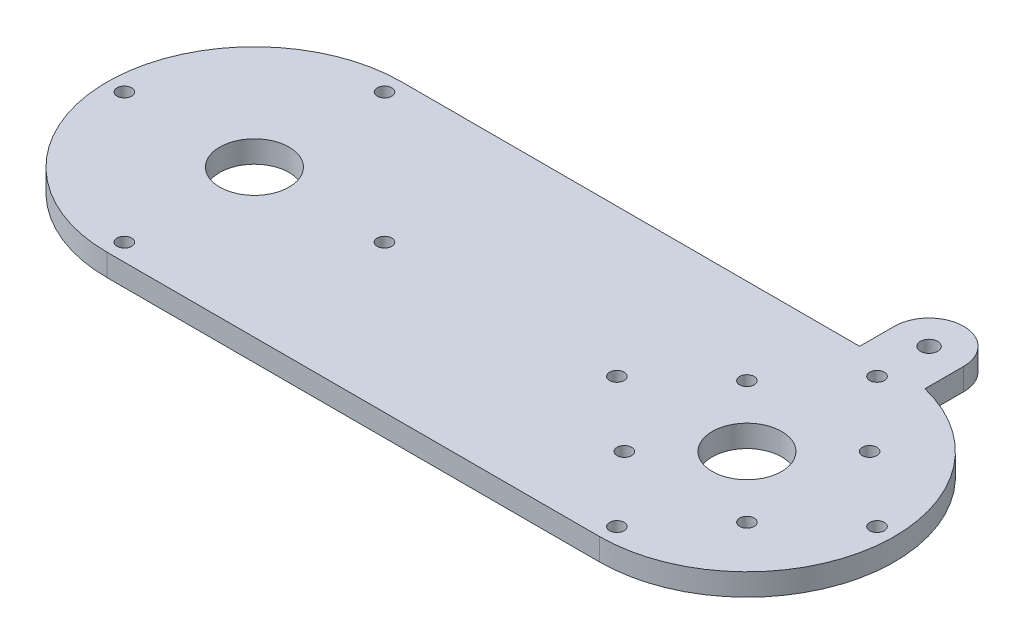
ISO-10303-21;
HEADER;
FILE_DESCRIPTION(('STEP AP214'),'2;1');
FILE_NAME('part.step','',(''),(''),'','','');
FILE_SCHEMA(('AUTOMOTIVE_DESIGN { 1 0 10303 214 1 1 1 1 }'));
ENDSEC;
DATA;
#1=APPLICATION_CONTEXT('core data for automotive mechanical design processes');
#2=APPLICATION_PROTOCOL_DEFINITION('international standard','automotive_design',2000,#1);
#3=PRODUCT_CONTEXT('',#1,'mechanical');
#4=PRODUCT('Part','Part','',(#3));
#5=PRODUCT_RELATED_PRODUCT_CATEGORY('part','',(#4));
#6=PRODUCT_DEFINITION_FORMATION('','',#4);
#7=PRODUCT_DEFINITION_CONTEXT('part definition',#1,'design');
#8=PRODUCT_DEFINITION('design','',#6,#7);
#9=PRODUCT_DEFINITION_SHAPE('','',#8);
#10=(LENGTH_UNIT() NAMED_UNIT(*) SI_UNIT(.MILLI.,.METRE.));
#11=(NAMED_UNIT(*) PLANE_ANGLE_UNIT() SI_UNIT($,.RADIAN.));
#12=(NAMED_UNIT(*) SI_UNIT($,.STERADIAN.) SOLID_ANGLE_UNIT());
#13=UNCERTAINTY_MEASURE_WITH_UNIT(LENGTH_MEASURE(1.E-05),#10,'distance_accuracy_value','');
#14=(GEOMETRIC_REPRESENTATION_CONTEXT(3) GLOBAL_UNCERTAINTY_ASSIGNED_CONTEXT((#13)) GLOBAL_UNIT_ASSIGNED_CONTEXT((#10,
#11,#12)) REPRESENTATION_CONTEXT('',''));
#15=CARTESIAN_POINT('',(0.,0.,0.));
#16=DIRECTION('',(0.,0.,1.));
#17=DIRECTION('',(1.,0.,0.));
#18=AXIS2_PLACEMENT_3D('',#15,#16,#17);
#19=CARTESIAN_POINT('',(0.,-6.35,42.5));
#20=DIRECTION('',(0.,0.,1.));
#21=DIRECTION('',(1.,0.,0.));
#22=AXIS2_PLACEMENT_3D('',#19,#20,#21);
#23=PLANE('',#22);
#24=DIRECTION('',(1.,0.,0.));
#25=VECTOR('',#24,1.);
#26=CARTESIAN_POINT('',(0.,0.,42.5));
#27=LINE('',#26,#25);
#28=CARTESIAN_POINT('',(-142.,0.,42.5));
#29=VERTEX_POINT('',#28);
#30=CARTESIAN_POINT('',(0.,0.,42.5));
#31=VERTEX_POINT('',#30);
#32=EDGE_CURVE('E171',#29,#31,#27,.T.);
#33=ORIENTED_EDGE('',*,*,#32,.F.);
#34=DIRECTION('',(0.,1.,0.));
#35=VECTOR('',#34,1.);
#36=CARTESIAN_POINT('',(-142.,-6.35,42.5));
#37=LINE('',#36,#35);
#38=CARTESIAN_POINT('',(-142.,-6.35,42.5));
#39=VERTEX_POINT('',#38);
#40=EDGE_CURVE('E11',#39,#29,#37,.T.);
#41=ORIENTED_EDGE('',*,*,#40,.F.);
#42=DIRECTION('',(1.,0.,0.));
#43=VECTOR('',#42,1.);
#44=CARTESIAN_POINT('',(0.,-6.35,42.5));
#45=LINE('',#44,#43);
#46=CARTESIAN_POINT('',(0.,-6.35,42.5));
#47=VERTEX_POINT('',#46);
#48=EDGE_CURVE('E233',#39,#47,#45,.T.);
#49=ORIENTED_EDGE('',*,*,#48,.T.);
#50=DIRECTION('',(0.,1.,0.));
#51=VECTOR('',#50,1.);
#52=CARTESIAN_POINT('',(0.,-6.35,42.5));
#53=LINE('',#52,#51);
#54=EDGE_CURVE('E37',#47,#31,#53,.T.);
#55=ORIENTED_EDGE('',*,*,#54,.T.);
#56=EDGE_LOOP('',(#33,#41,#49,#55));
#57=FACE_BOUND('',#56,.T.);
#58=ADVANCED_FACE('F34',(#57),#23,.T.);
#59=CARTESIAN_POINT('',(-142.,-6.35,0.));
#60=DIRECTION('',(0.,1.,0.));
#61=DIRECTION('',(0.,0.,1.));
#62=AXIS2_PLACEMENT_3D('',#59,#60,#61);
#63=CYLINDRICAL_SURFACE('',#62,42.5);
#64=CARTESIAN_POINT('',(-142.,0.,0.));
#65=DIRECTION('',(0.,1.,0.));
#66=DIRECTION('',(0.,0.,1.));
#67=AXIS2_PLACEMENT_3D('',#64,#65,#66);
#68=CIRCLE('',#67,42.5);
#69=CARTESIAN_POINT('',(-142.,0.,-42.5));
#70=VERTEX_POINT('',#69);
#71=EDGE_CURVE('E186',#70,#29,#68,.T.);
#72=ORIENTED_EDGE('',*,*,#71,.F.);
#73=DIRECTION('',(0.,1.,0.));
#74=VECTOR('',#73,1.);
#75=CARTESIAN_POINT('',(-142.,-6.35,-42.5));
#76=LINE('',#75,#74);
#77=CARTESIAN_POINT('',(-142.,-6.35,-42.5));
#78=VERTEX_POINT('',#77);
#79=EDGE_CURVE('E43',#78,#70,#76,.T.);
#80=ORIENTED_EDGE('',*,*,#79,.F.);
#81=CARTESIAN_POINT('',(-142.,-6.35,0.));
#82=DIRECTION('',(0.,1.,0.));
#83=DIRECTION('',(0.,0.,1.));
#84=AXIS2_PLACEMENT_3D('',#81,#82,#83);
#85=CIRCLE('',#84,42.5);
#86=EDGE_CURVE('E106',#78,#39,#85,.T.);
#87=ORIENTED_EDGE('',*,*,#86,.T.);
#88=ORIENTED_EDGE('',*,*,#40,.T.);
#89=EDGE_LOOP('',(#72,#80,#87,#88));
#90=FACE_BOUND('',#89,.T.);
#91=ADVANCED_FACE('F245',(#90),#63,.T.);
#92=CARTESIAN_POINT('',(0.,-6.35,-42.5));
#93=DIRECTION('',(0.,0.,1.));
#94=DIRECTION('',(1.,0.,0.));
#95=AXIS2_PLACEMENT_3D('',#92,#93,#94);
#96=PLANE('',#95);
#97=DIRECTION('',(1.,0.,0.));
#98=VECTOR('',#97,1.);
#99=CARTESIAN_POINT('',(0.,0.,-42.5));
#100=LINE('',#99,#98);
#101=CARTESIAN_POINT('',(-10.,0.,-42.5));
#102=VERTEX_POINT('',#101);
#103=EDGE_CURVE('E111',#70,#102,#100,.T.);
#104=ORIENTED_EDGE('',*,*,#103,.T.);
#105=DIRECTION('',(0.,1.,0.));
#106=VECTOR('',#105,1.);
#107=CARTESIAN_POINT('',(-10.,-6.35,-42.5));
#108=LINE('',#107,#106);
#109=CARTESIAN_POINT('',(-10.,-6.35,-42.5));
#110=VERTEX_POINT('',#109);
#111=EDGE_CURVE('E109',#110,#102,#108,.T.);
#112=ORIENTED_EDGE('',*,*,#111,.F.);
#113=DIRECTION('',(1.,0.,0.));
#114=VECTOR('',#113,1.);
#115=CARTESIAN_POINT('',(0.,-6.35,-42.5));
#116=LINE('',#115,#114);
#117=EDGE_CURVE('E98',#78,#110,#116,.T.);
#118=ORIENTED_EDGE('',*,*,#117,.F.);
#119=ORIENTED_EDGE('',*,*,#79,.T.);
#120=EDGE_LOOP('',(#104,#112,#118,#119));
#121=FACE_BOUND('',#120,.T.);
#122=ADVANCED_FACE('F110',(#121),#96,.F.);
#123=CARTESIAN_POINT('',(-10.0000000000001,-6.35,0.));
#124=DIRECTION('',(1.,0.,0.));
#125=DIRECTION('',(0.,0.,-1.));
#126=AXIS2_PLACEMENT_3D('',#123,#124,#125);
#127=PLANE('',#126);
#128=DIRECTION('',(0.,0.,-1.));
#129=VECTOR('',#128,1.);
#130=CARTESIAN_POINT('',(-10.0000000000001,0.,0.));
#131=LINE('',#130,#129);
#132=CARTESIAN_POINT('',(-10.,0.,-52.5));
#133=VERTEX_POINT('',#132);
#134=EDGE_CURVE('E183',#102,#133,#131,.T.);
#135=ORIENTED_EDGE('',*,*,#134,.T.);
#136=DIRECTION('',(0.,1.,0.));
#137=VECTOR('',#136,1.);
#138=CARTESIAN_POINT('',(-10.,-6.35,-52.5));
#139=LINE('',#138,#137);
#140=CARTESIAN_POINT('',(-10.,-6.35,-52.5));
#141=VERTEX_POINT('',#140);
#142=EDGE_CURVE('E115',#141,#133,#139,.T.);
#143=ORIENTED_EDGE('',*,*,#142,.F.);
#144=DIRECTION('',(0.,0.,-1.));
#145=VECTOR('',#144,1.);
#146=CARTESIAN_POINT('',(-10.0000000000001,-6.35,0.));
#147=LINE('',#146,#145);
#148=EDGE_CURVE('E104',#110,#141,#147,.T.);
#149=ORIENTED_EDGE('',*,*,#148,.F.);
#150=ORIENTED_EDGE('',*,*,#111,.T.);
#151=EDGE_LOOP('',(#135,#143,#149,#150));
#152=FACE_BOUND('',#151,.T.);
#153=ADVANCED_FACE('F117',(#152),#127,.F.);
#154=CARTESIAN_POINT('',(0.,-6.35,-52.5));
#155=DIRECTION('',(0.,1.,0.));
#156=DIRECTION('',(0.,0.,1.));
#157=AXIS2_PLACEMENT_3D('',#154,#155,#156);
#158=CYLINDRICAL_SURFACE('',#157,10.);
#159=CARTESIAN_POINT('',(0.,0.,-52.5));
#160=DIRECTION('',(0.,1.,0.));
#161=DIRECTION('',(0.,0.,1.));
#162=AXIS2_PLACEMENT_3D('',#159,#160,#161);
#163=CIRCLE('',#162,10.);
#164=CARTESIAN_POINT('',(10.,0.,-52.5));
#165=VERTEX_POINT('',#164);
#166=EDGE_CURVE('E180',#165,#133,#163,.T.);
#167=ORIENTED_EDGE('',*,*,#166,.F.);
#168=DIRECTION('',(0.,1.,0.));
#169=VECTOR('',#168,1.);
#170=CARTESIAN_POINT('',(10.,-6.35,-52.5));
#171=LINE('',#170,#169);
#172=CARTESIAN_POINT('',(10.,-6.35,-52.5));
#173=VERTEX_POINT('',#172);
#174=EDGE_CURVE('E237',#173,#165,#171,.T.);
#175=ORIENTED_EDGE('',*,*,#174,.F.);
#176=CARTESIAN_POINT('',(0.,-6.35,-52.5));
#177=DIRECTION('',(0.,1.,0.));
#178=DIRECTION('',(0.,0.,1.));
#179=AXIS2_PLACEMENT_3D('',#176,#177,#178);
#180=CIRCLE('',#179,10.);
#181=EDGE_CURVE('E119',#173,#141,#180,.T.);
#182=ORIENTED_EDGE('',*,*,#181,.T.);
#183=ORIENTED_EDGE('',*,*,#142,.T.);
#184=EDGE_LOOP('',(#167,#175,#182,#183));
#185=FACE_BOUND('',#184,.T.);
#186=ADVANCED_FACE('F259',(#185),#158,.T.);
#187=CARTESIAN_POINT('',(9.99999999999993,-6.35,0.));
#188=DIRECTION('',(-1.,0.,0.));
#189=DIRECTION('',(0.,0.,1.));
#190=AXIS2_PLACEMENT_3D('',#187,#188,#189);
#191=PLANE('',#190);
#192=DIRECTION('',(0.,0.,1.));
#193=VECTOR('',#192,1.);
#194=CARTESIAN_POINT('',(9.99999999999993,0.,0.));
#195=LINE('',#194,#193);
#196=CARTESIAN_POINT('',(9.99999999999999,0.,-41.3067791046458));
#197=VERTEX_POINT('',#196);
#198=EDGE_CURVE('E177',#165,#197,#195,.T.);
#199=ORIENTED_EDGE('',*,*,#198,.T.);
#200=DIRECTION('',(0.,1.,0.));
#201=VECTOR('',#200,1.);
#202=CARTESIAN_POINT('',(9.99999999999999,-6.35,-41.3067791046458));
#203=LINE('',#202,#201);
#204=CARTESIAN_POINT('',(9.99999999999999,-6.35,-41.3067791046458));
#205=VERTEX_POINT('',#204);
#206=EDGE_CURVE('E238',#205,#197,#203,.T.);
#207=ORIENTED_EDGE('',*,*,#206,.F.);
#208=DIRECTION('',(0.,0.,1.));
#209=VECTOR('',#208,1.);
#210=CARTESIAN_POINT('',(9.99999999999993,-6.35,0.));
#211=LINE('',#210,#209);
#212=EDGE_CURVE('E121',#173,#205,#211,.T.);
#213=ORIENTED_EDGE('',*,*,#212,.F.);
#214=ORIENTED_EDGE('',*,*,#174,.T.);
#215=EDGE_LOOP('',(#199,#207,#213,#214));
#216=FACE_BOUND('',#215,.T.);
#217=ADVANCED_FACE('F262',(#216),#191,.F.);
#218=CARTESIAN_POINT('',(-179.5,-6.35,0.));
#219=DIRECTION('',(0.,1.,0.));
#220=DIRECTION('',(0.,0.,1.));
#221=AXIS2_PLACEMENT_3D('',#218,#219,#220);
#222=CYLINDRICAL_SURFACE('',#221,2.09999999999999);
#223=CARTESIAN_POINT('',(-179.5,-6.35,0.));
#224=DIRECTION('',(0.,1.,0.));
#225=DIRECTION('',(0.,0.,1.));
#226=AXIS2_PLACEMENT_3D('',#223,#224,#225);
#227=CIRCLE('',#226,2.09999999999999);
#228=CARTESIAN_POINT('',(-179.5,-6.35,2.09999999999999));
#229=VERTEX_POINT('',#228);
#230=EDGE_CURVE('E165',#229,#229,#227,.T.);
#231=ORIENTED_EDGE('',*,*,#230,.F.);
#232=EDGE_LOOP('',(#231));
#233=FACE_BOUND('',#232,.T.);
#234=CARTESIAN_POINT('',(-179.5,0.,0.));
#235=DIRECTION('',(0.,1.,0.));
#236=DIRECTION('',(0.,0.,1.));
#237=AXIS2_PLACEMENT_3D('',#234,#235,#236);
#238=CIRCLE('',#237,2.09999999999999);
#239=CARTESIAN_POINT('',(-179.5,0.,2.09999999999999));
#240=VERTEX_POINT('',#239);
#241=EDGE_CURVE('E228',#240,#240,#238,.T.);
#242=ORIENTED_EDGE('',*,*,#241,.T.);
#243=EDGE_LOOP('',(#242));
#244=FACE_BOUND('',#243,.T.);
#245=ADVANCED_FACE('F265',(#233,#244),#222,.F.);
#246=CARTESIAN_POINT('',(-142.,-6.35,-37.5));
#247=DIRECTION('',(0.,1.,0.));
#248=DIRECTION('',(0.,0.,1.));
#249=AXIS2_PLACEMENT_3D('',#246,#247,#248);
#250=CYLINDRICAL_SURFACE('',#249,2.09999999999999);
#251=CARTESIAN_POINT('',(-142.,-6.35,-37.5));
#252=DIRECTION('',(0.,1.,0.));
#253=DIRECTION('',(0.,0.,1.));
#254=AXIS2_PLACEMENT_3D('',#251,#252,#253);
#255=CIRCLE('',#254,2.09999999999999);
#256=CARTESIAN_POINT('',(-142.,-6.35,-35.4));
#257=VERTEX_POINT('',#256);
#258=EDGE_CURVE('E162',#257,#257,#255,.T.);
#259=ORIENTED_EDGE('',*,*,#258,.F.);
#260=EDGE_LOOP('',(#259));
#261=FACE_BOUND('',#260,.T.);
#262=CARTESIAN_POINT('',(-142.,0.,-37.5));
#263=DIRECTION('',(0.,1.,0.));
#264=DIRECTION('',(0.,0.,1.));
#265=AXIS2_PLACEMENT_3D('',#262,#263,#264);
#266=CIRCLE('',#265,2.09999999999999);
#267=CARTESIAN_POINT('',(-142.,0.,-35.4));
#268=VERTEX_POINT('',#267);
#269=EDGE_CURVE('E225',#268,#268,#266,.T.);
#270=ORIENTED_EDGE('',*,*,#269,.T.);
#271=EDGE_LOOP('',(#270));
#272=FACE_BOUND('',#271,.T.);
#273=ADVANCED_FACE('F318',(#261,#272),#250,.F.);
#274=CARTESIAN_POINT('',(-142.,-6.35,37.5));
#275=DIRECTION('',(0.,1.,0.));
#276=DIRECTION('',(0.,0.,1.));
#277=AXIS2_PLACEMENT_3D('',#274,#275,#276);
#278=CYLINDRICAL_SURFACE('',#277,2.09999999999999);
#279=CARTESIAN_POINT('',(-142.,-6.35,37.5));
#280=DIRECTION('',(0.,1.,0.));
#281=DIRECTION('',(0.,0.,1.));
#282=AXIS2_PLACEMENT_3D('',#279,#280,#281);
#283=CIRCLE('',#282,2.09999999999999);
#284=CARTESIAN_POINT('',(-142.,-6.35,39.6));
#285=VERTEX_POINT('',#284);
#286=EDGE_CURVE('E159',#285,#285,#283,.T.);
#287=ORIENTED_EDGE('',*,*,#286,.F.);
#288=EDGE_LOOP('',(#287));
#289=FACE_BOUND('',#288,.T.);
#290=CARTESIAN_POINT('',(-142.,0.,37.5));
#291=DIRECTION('',(0.,1.,0.));
#292=DIRECTION('',(0.,0.,1.));
#293=AXIS2_PLACEMENT_3D('',#290,#291,#292);
#294=CIRCLE('',#293,2.09999999999999);
#295=CARTESIAN_POINT('',(-142.,0.,39.6));
#296=VERTEX_POINT('',#295);
#297=EDGE_CURVE('E222',#296,#296,#294,.T.);
#298=ORIENTED_EDGE('',*,*,#297,.T.);
#299=EDGE_LOOP('',(#298));
#300=FACE_BOUND('',#299,.T.);
#301=ADVANCED_FACE('F324',(#289,#300),#278,.F.);
#302=CARTESIAN_POINT('',(-104.5,-6.35,0.));
#303=DIRECTION('',(0.,1.,0.));
#304=DIRECTION('',(0.,0.,1.));
#305=AXIS2_PLACEMENT_3D('',#302,#303,#304);
#306=CYLINDRICAL_SURFACE('',#305,2.1);
#307=CARTESIAN_POINT('',(-104.5,-6.35,0.));
#308=DIRECTION('',(0.,1.,0.));
#309=DIRECTION('',(0.,0.,1.));
#310=AXIS2_PLACEMENT_3D('',#307,#308,#309);
#311=CIRCLE('',#310,2.1);
#312=CARTESIAN_POINT('',(-104.5,-6.35,2.1));
#313=VERTEX_POINT('',#312);
#314=EDGE_CURVE('E156',#313,#313,#311,.T.);
#315=ORIENTED_EDGE('',*,*,#314,.F.);
#316=EDGE_LOOP('',(#315));
#317=FACE_BOUND('',#316,.T.);
#318=CARTESIAN_POINT('',(-104.5,0.,0.));
#319=DIRECTION('',(0.,1.,0.));
#320=DIRECTION('',(0.,0.,1.));
#321=AXIS2_PLACEMENT_3D('',#318,#319,#320);
#322=CIRCLE('',#321,2.1);
#323=CARTESIAN_POINT('',(-104.5,0.,2.1));
#324=VERTEX_POINT('',#323);
#325=EDGE_CURVE('E219',#324,#324,#322,.T.);
#326=ORIENTED_EDGE('',*,*,#325,.T.);
#327=EDGE_LOOP('',(#326));
#328=FACE_BOUND('',#327,.T.);
#329=ADVANCED_FACE('F331',(#317,#328),#306,.F.);
#330=CARTESIAN_POINT('',(0.,-6.35,0.));
#331=DIRECTION('',(0.,1.,0.));
#332=DIRECTION('',(0.,0.,1.));
#333=AXIS2_PLACEMENT_3D('',#330,#331,#332);
#334=CYLINDRICAL_SURFACE('',#333,10.);
#335=CARTESIAN_POINT('',(0.,-6.35,0.));
#336=DIRECTION('',(0.,1.,0.));
#337=DIRECTION('',(0.,0.,1.));
#338=AXIS2_PLACEMENT_3D('',#335,#336,#337);
#339=CIRCLE('',#338,10.);
#340=CARTESIAN_POINT('',(0.,-6.35,10.));
#341=VERTEX_POINT('',#340);
#342=EDGE_CURVE('E153',#341,#341,#339,.T.);
#343=ORIENTED_EDGE('',*,*,#342,.F.);
#344=EDGE_LOOP('',(#343));
#345=FACE_BOUND('',#344,.T.);
#346=CARTESIAN_POINT('',(0.,0.,0.));
#347=DIRECTION('',(0.,1.,0.));
#348=DIRECTION('',(0.,0.,1.));
#349=AXIS2_PLACEMENT_3D('',#346,#347,#348);
#350=CIRCLE('',#349,10.);
#351=CARTESIAN_POINT('',(0.,0.,10.));
#352=VERTEX_POINT('',#351);
#353=EDGE_CURVE('E216',#352,#352,#350,.T.);
#354=ORIENTED_EDGE('',*,*,#353,.T.);
#355=EDGE_LOOP('',(#354));
#356=FACE_BOUND('',#355,.T.);
#357=ADVANCED_FACE('F335',(#345,#356),#334,.F.);
#358=CARTESIAN_POINT('',(0.,-6.35,-37.5));
#359=DIRECTION('',(0.,1.,0.));
#360=DIRECTION('',(0.,0.,1.));
#361=AXIS2_PLACEMENT_3D('',#358,#359,#360);
#362=CYLINDRICAL_SURFACE('',#361,2.1);
#363=CARTESIAN_POINT('',(0.,-6.35,-37.5));
#364=DIRECTION('',(0.,1.,0.));
#365=DIRECTION('',(0.,0.,1.));
#366=AXIS2_PLACEMENT_3D('',#363,#364,#365);
#367=CIRCLE('',#366,2.1);
#368=CARTESIAN_POINT('',(0.,-6.35,-35.4));
#369=VERTEX_POINT('',#368);
#370=EDGE_CURVE('E150',#369,#369,#367,.T.);
#371=ORIENTED_EDGE('',*,*,#370,.F.);
#372=EDGE_LOOP('',(#371));
#373=FACE_BOUND('',#372,.T.);
#374=CARTESIAN_POINT('',(0.,0.,-37.5));
#375=DIRECTION('',(0.,1.,0.));
#376=DIRECTION('',(0.,0.,1.));
#377=AXIS2_PLACEMENT_3D('',#374,#375,#376);
#378=CIRCLE('',#377,2.1);
#379=CARTESIAN_POINT('',(0.,0.,-35.4));
#380=VERTEX_POINT('',#379);
#381=EDGE_CURVE('E213',#380,#380,#378,.T.);
#382=ORIENTED_EDGE('',*,*,#381,.T.);
#383=EDGE_LOOP('',(#382));
#384=FACE_BOUND('',#383,.T.);
#385=ADVANCED_FACE('F339',(#373,#384),#362,.F.);
#386=CARTESIAN_POINT('',(37.5,-6.35,0.));
#387=DIRECTION('',(0.,1.,0.));
#388=DIRECTION('',(0.,0.,1.));
#389=AXIS2_PLACEMENT_3D('',#386,#387,#388);
#390=CYLINDRICAL_SURFACE('',#389,2.1);
#391=CARTESIAN_POINT('',(37.5,-6.35,0.));
#392=DIRECTION('',(0.,1.,0.));
#393=DIRECTION('',(0.,0.,1.));
#394=AXIS2_PLACEMENT_3D('',#391,#392,#393);
#395=CIRCLE('',#394,2.1);
#396=CARTESIAN_POINT('',(37.5,-6.35,2.1));
#397=VERTEX_POINT('',#396);
#398=EDGE_CURVE('E147',#397,#397,#395,.T.);
#399=ORIENTED_EDGE('',*,*,#398,.F.);
#400=EDGE_LOOP('',(#399));
#401=FACE_BOUND('',#400,.T.);
#402=CARTESIAN_POINT('',(37.5,0.,0.));
#403=DIRECTION('',(0.,1.,0.));
#404=DIRECTION('',(0.,0.,1.));
#405=AXIS2_PLACEMENT_3D('',#402,#403,#404);
#406=CIRCLE('',#405,2.1);
#407=CARTESIAN_POINT('',(37.5,0.,2.1));
#408=VERTEX_POINT('',#407);
#409=EDGE_CURVE('E210',#408,#408,#406,.T.);
#410=ORIENTED_EDGE('',*,*,#409,.T.);
#411=EDGE_LOOP('',(#410));
#412=FACE_BOUND('',#411,.T.);
#413=ADVANCED_FACE('F343',(#401,#412),#390,.F.);
#414=CARTESIAN_POINT('',(0.,-6.35,37.5));
#415=DIRECTION('',(0.,1.,0.));
#416=DIRECTION('',(0.,0.,1.));
#417=AXIS2_PLACEMENT_3D('',#414,#415,#416);
#418=CYLINDRICAL_SURFACE('',#417,2.1);
#419=CARTESIAN_POINT('',(0.,-6.35,37.5));
#420=DIRECTION('',(0.,1.,0.));
#421=DIRECTION('',(0.,0.,1.));
#422=AXIS2_PLACEMENT_3D('',#419,#420,#421);
#423=CIRCLE('',#422,2.1);
#424=CARTESIAN_POINT('',(0.,-6.35,39.6));
#425=VERTEX_POINT('',#424);
#426=EDGE_CURVE('E144',#425,#425,#423,.T.);
#427=ORIENTED_EDGE('',*,*,#426,.F.);
#428=EDGE_LOOP('',(#427));
#429=FACE_BOUND('',#428,.T.);
#430=CARTESIAN_POINT('',(0.,0.,37.5));
#431=DIRECTION('',(0.,1.,0.));
#432=DIRECTION('',(0.,0.,1.));
#433=AXIS2_PLACEMENT_3D('',#430,#431,#432);
#434=CIRCLE('',#433,2.1);
#435=CARTESIAN_POINT('',(0.,0.,39.6));
#436=VERTEX_POINT('',#435);
#437=EDGE_CURVE('E207',#436,#436,#434,.T.);
#438=ORIENTED_EDGE('',*,*,#437,.T.);
#439=EDGE_LOOP('',(#438));
#440=FACE_BOUND('',#439,.T.);
#441=ADVANCED_FACE('F347',(#429,#440),#418,.F.);
#442=CARTESIAN_POINT('',(-37.5,-6.35,0.));
#443=DIRECTION('',(0.,1.,0.));
#444=DIRECTION('',(0.,0.,1.));
#445=AXIS2_PLACEMENT_3D('',#442,#443,#444);
#446=CYLINDRICAL_SURFACE('',#445,2.1);
#447=CARTESIAN_POINT('',(-37.5,-6.35,0.));
#448=DIRECTION('',(0.,1.,0.));
#449=DIRECTION('',(0.,0.,1.));
#450=AXIS2_PLACEMENT_3D('',#447,#448,#449);
#451=CIRCLE('',#450,2.1);
#452=CARTESIAN_POINT('',(-37.5,-6.35,2.1));
#453=VERTEX_POINT('',#452);
#454=EDGE_CURVE('E141',#453,#453,#451,.T.);
#455=ORIENTED_EDGE('',*,*,#454,.F.);
#456=EDGE_LOOP('',(#455));
#457=FACE_BOUND('',#456,.T.);
#458=CARTESIAN_POINT('',(-37.5,0.,0.));
#459=DIRECTION('',(0.,1.,0.));
#460=DIRECTION('',(0.,0.,1.));
#461=AXIS2_PLACEMENT_3D('',#458,#459,#460);
#462=CIRCLE('',#461,2.1);
#463=CARTESIAN_POINT('',(-37.5,0.,2.1));
#464=VERTEX_POINT('',#463);
#465=EDGE_CURVE('E204',#464,#464,#462,.T.);
#466=ORIENTED_EDGE('',*,*,#465,.T.);
#467=EDGE_LOOP('',(#466));
#468=FACE_BOUND('',#467,.T.);
#469=ADVANCED_FACE('F351',(#457,#468),#446,.F.);
#470=CARTESIAN_POINT('',(-17.6776695296638,-6.35,-17.6776695296636));
#471=DIRECTION('',(0.,1.,0.));
#472=DIRECTION('',(0.,0.,1.));
#473=AXIS2_PLACEMENT_3D('',#470,#471,#472);
#474=CYLINDRICAL_SURFACE('',#473,2.1);
#475=CARTESIAN_POINT('',(-17.6776695296638,-6.35,-17.6776695296636));
#476=DIRECTION('',(0.,1.,0.));
#477=DIRECTION('',(0.,0.,1.));
#478=AXIS2_PLACEMENT_3D('',#475,#476,#477);
#479=CIRCLE('',#478,2.1);
#480=CARTESIAN_POINT('',(-17.6776695296638,-6.35,-15.5776695296636));
#481=VERTEX_POINT('',#480);
#482=EDGE_CURVE('E138',#481,#481,#479,.T.);
#483=ORIENTED_EDGE('',*,*,#482,.F.);
#484=EDGE_LOOP('',(#483));
#485=FACE_BOUND('',#484,.T.);
#486=CARTESIAN_POINT('',(-17.6776695296638,0.,-17.6776695296636));
#487=DIRECTION('',(0.,1.,0.));
#488=DIRECTION('',(0.,0.,1.));
#489=AXIS2_PLACEMENT_3D('',#486,#487,#488);
#490=CIRCLE('',#489,2.1);
#491=CARTESIAN_POINT('',(-17.6776695296638,0.,-15.5776695296636));
#492=VERTEX_POINT('',#491);
#493=EDGE_CURVE('E201',#492,#492,#490,.T.);
#494=ORIENTED_EDGE('',*,*,#493,.T.);
#495=EDGE_LOOP('',(#494));
#496=FACE_BOUND('',#495,.T.);
#497=ADVANCED_FACE('F355',(#485,#496),#474,.F.);
#498=CARTESIAN_POINT('',(17.6776695296638,-6.35,17.6776695296636));
#499=DIRECTION('',(0.,1.,0.));
#500=DIRECTION('',(0.,0.,1.));
#501=AXIS2_PLACEMENT_3D('',#498,#499,#500);
#502=CYLINDRICAL_SURFACE('',#501,2.1);
#503=CARTESIAN_POINT('',(17.6776695296638,-6.35,17.6776695296636));
#504=DIRECTION('',(0.,1.,0.));
#505=DIRECTION('',(0.,0.,1.));
#506=AXIS2_PLACEMENT_3D('',#503,#504,#505);
#507=CIRCLE('',#506,2.1);
#508=CARTESIAN_POINT('',(17.6776695296638,-6.35,19.7776695296636));
#509=VERTEX_POINT('',#508);
#510=EDGE_CURVE('E135',#509,#509,#507,.T.);
#511=ORIENTED_EDGE('',*,*,#510,.F.);
#512=EDGE_LOOP('',(#511));
#513=FACE_BOUND('',#512,.T.);
#514=CARTESIAN_POINT('',(17.6776695296638,0.,17.6776695296636));
#515=DIRECTION('',(0.,1.,0.));
#516=DIRECTION('',(0.,0.,1.));
#517=AXIS2_PLACEMENT_3D('',#514,#515,#516);
#518=CIRCLE('',#517,2.1);
#519=CARTESIAN_POINT('',(17.6776695296638,0.,19.7776695296636));
#520=VERTEX_POINT('',#519);
#521=EDGE_CURVE('E198',#520,#520,#518,.T.);
#522=ORIENTED_EDGE('',*,*,#521,.T.);
#523=EDGE_LOOP('',(#522));
#524=FACE_BOUND('',#523,.T.);
#525=ADVANCED_FACE('F359',(#513,#524),#502,.F.);
#526=CARTESIAN_POINT('',(-17.6776695296636,-6.35,17.6776695296638));
#527=DIRECTION('',(0.,1.,0.));
#528=DIRECTION('',(0.,0.,1.));
#529=AXIS2_PLACEMENT_3D('',#526,#527,#528);
#530=CYLINDRICAL_SURFACE('',#529,2.1);
#531=CARTESIAN_POINT('',(-17.6776695296636,-6.35,17.6776695296638));
#532=DIRECTION('',(0.,1.,0.));
#533=DIRECTION('',(0.,0.,1.));
#534=AXIS2_PLACEMENT_3D('',#531,#532,#533);
#535=CIRCLE('',#534,2.1);
#536=CARTESIAN_POINT('',(-17.6776695296636,-6.35,19.7776695296638));
#537=VERTEX_POINT('',#536);
#538=EDGE_CURVE('E132',#537,#537,#535,.T.);
#539=ORIENTED_EDGE('',*,*,#538,.F.);
#540=EDGE_LOOP('',(#539));
#541=FACE_BOUND('',#540,.T.);
#542=CARTESIAN_POINT('',(-17.6776695296636,0.,17.6776695296638));
#543=DIRECTION('',(0.,1.,0.));
#544=DIRECTION('',(0.,0.,1.));
#545=AXIS2_PLACEMENT_3D('',#542,#543,#544);
#546=CIRCLE('',#545,2.1);
#547=CARTESIAN_POINT('',(-17.6776695296636,0.,19.7776695296638));
#548=VERTEX_POINT('',#547);
#549=EDGE_CURVE('E195',#548,#548,#546,.T.);
#550=ORIENTED_EDGE('',*,*,#549,.T.);
#551=EDGE_LOOP('',(#550));
#552=FACE_BOUND('',#551,.T.);
#553=ADVANCED_FACE('F280',(#541,#552),#530,.F.);
#554=CARTESIAN_POINT('',(17.6776695296636,-6.35,-17.6776695296638));
#555=DIRECTION('',(0.,1.,0.));
#556=DIRECTION('',(0.,0.,1.));
#557=AXIS2_PLACEMENT_3D('',#554,#555,#556);
#558=CYLINDRICAL_SURFACE('',#557,2.1);
#559=CARTESIAN_POINT('',(17.6776695296636,-6.35,-17.6776695296638));
#560=DIRECTION('',(0.,1.,0.));
#561=DIRECTION('',(0.,0.,1.));
#562=AXIS2_PLACEMENT_3D('',#559,#560,#561);
#563=CIRCLE('',#562,2.1);
#564=CARTESIAN_POINT('',(17.6776695296636,-6.35,-15.5776695296638));
#565=VERTEX_POINT('',#564);
#566=EDGE_CURVE('E129',#565,#565,#563,.T.);
#567=ORIENTED_EDGE('',*,*,#566,.F.);
#568=EDGE_LOOP('',(#567));
#569=FACE_BOUND('',#568,.T.);
#570=CARTESIAN_POINT('',(17.6776695296636,0.,-17.6776695296638));
#571=DIRECTION('',(0.,1.,0.));
#572=DIRECTION('',(0.,0.,1.));
#573=AXIS2_PLACEMENT_3D('',#570,#571,#572);
#574=CIRCLE('',#573,2.1);
#575=CARTESIAN_POINT('',(17.6776695296636,0.,-15.5776695296638));
#576=VERTEX_POINT('',#575);
#577=EDGE_CURVE('E192',#576,#576,#574,.T.);
#578=ORIENTED_EDGE('',*,*,#577,.T.);
#579=EDGE_LOOP('',(#578));
#580=FACE_BOUND('',#579,.T.);
#581=ADVANCED_FACE('F275',(#569,#580),#558,.F.);
#582=CARTESIAN_POINT('',(0.,-6.35,-52.5));
#583=DIRECTION('',(0.,1.,0.));
#584=DIRECTION('',(0.,0.,1.));
#585=AXIS2_PLACEMENT_3D('',#582,#583,#584);
#586=CYLINDRICAL_SURFACE('',#585,2.5);
#587=CARTESIAN_POINT('',(0.,-6.35,-52.5));
#588=DIRECTION('',(0.,1.,0.));
#589=DIRECTION('',(0.,0.,1.));
#590=AXIS2_PLACEMENT_3D('',#587,#588,#589);
#591=CIRCLE('',#590,2.5);
#592=CARTESIAN_POINT('',(0.,-6.35,-50.));
#593=VERTEX_POINT('',#592);
#594=EDGE_CURVE('E126',#593,#593,#591,.T.);
#595=ORIENTED_EDGE('',*,*,#594,.F.);
#596=EDGE_LOOP('',(#595));
#597=FACE_BOUND('',#596,.T.);
#598=CARTESIAN_POINT('',(0.,0.,-52.5));
#599=DIRECTION('',(0.,1.,0.));
#600=DIRECTION('',(0.,0.,1.));
#601=AXIS2_PLACEMENT_3D('',#598,#599,#600);
#602=CIRCLE('',#601,2.5);
#603=CARTESIAN_POINT('',(0.,0.,-50.));
#604=VERTEX_POINT('',#603);
#605=EDGE_CURVE('E189',#604,#604,#602,.T.);
#606=ORIENTED_EDGE('',*,*,#605,.T.);
#607=EDGE_LOOP('',(#606));
#608=FACE_BOUND('',#607,.T.);
#609=ADVANCED_FACE('F254',(#597,#608),#586,.F.);
#610=CARTESIAN_POINT('',(0.,-6.35,0.));
#611=DIRECTION('',(0.,1.,0.));
#612=DIRECTION('',(0.,0.,1.));
#613=AXIS2_PLACEMENT_3D('',#610,#611,#612);
#614=CYLINDRICAL_SURFACE('',#613,42.5);
#615=CARTESIAN_POINT('',(0.,0.,0.));
#616=DIRECTION('',(0.,1.,0.));
#617=DIRECTION('',(0.,0.,1.));
#618=AXIS2_PLACEMENT_3D('',#615,#616,#617);
#619=CIRCLE('',#618,42.5);
#620=EDGE_CURVE('E174',#31,#197,#619,.T.);
#621=ORIENTED_EDGE('',*,*,#620,.F.);
#622=ORIENTED_EDGE('',*,*,#54,.F.);
#623=CARTESIAN_POINT('',(0.,-6.35,0.));
#624=DIRECTION('',(0.,1.,0.));
#625=DIRECTION('',(0.,0.,1.));
#626=AXIS2_PLACEMENT_3D('',#623,#624,#625);
#627=CIRCLE('',#626,42.5);
#628=EDGE_CURVE('E581',#47,#205,#627,.T.);
#629=ORIENTED_EDGE('',*,*,#628,.T.);
#630=ORIENTED_EDGE('',*,*,#206,.T.);
#631=EDGE_LOOP('',(#621,#622,#629,#630));
#632=FACE_BOUND('',#631,.T.);
#633=ADVANCED_FACE('F240',(#632),#614,.T.);
#634=CARTESIAN_POINT('',(-142.,-6.35,0.));
#635=DIRECTION('',(0.,1.,0.));
#636=DIRECTION('',(0.,0.,1.));
#637=AXIS2_PLACEMENT_3D('',#634,#635,#636);
#638=CYLINDRICAL_SURFACE('',#637,9.99999999999998);
#639=CARTESIAN_POINT('',(-142.,-6.35,0.));
#640=DIRECTION('',(0.,1.,0.));
#641=DIRECTION('',(0.,0.,1.));
#642=AXIS2_PLACEMENT_3D('',#639,#640,#641);
#643=CIRCLE('',#642,9.99999999999998);
#644=CARTESIAN_POINT('',(-142.,-6.35,9.99999999999998));
#645=VERTEX_POINT('',#644);
#646=EDGE_CURVE('E168',#645,#645,#643,.T.);
#647=ORIENTED_EDGE('',*,*,#646,.F.);
#648=EDGE_LOOP('',(#647));
#649=FACE_BOUND('',#648,.T.);
#650=CARTESIAN_POINT('',(-142.,0.,0.));
#651=DIRECTION('',(0.,1.,0.));
#652=DIRECTION('',(0.,0.,1.));
#653=AXIS2_PLACEMENT_3D('',#650,#651,#652);
#654=CIRCLE('',#653,9.99999999999998);
#655=CARTESIAN_POINT('',(-142.,0.,9.99999999999998));
#656=VERTEX_POINT('',#655);
#657=EDGE_CURVE('E231',#656,#656,#654,.T.);
#658=ORIENTED_EDGE('',*,*,#657,.T.);
#659=EDGE_LOOP('',(#658));
#660=FACE_BOUND('',#659,.T.);
#661=ADVANCED_FACE('F268',(#649,#660),#638,.F.);
#662=CARTESIAN_POINT('',(0.,-6.35,0.));
#663=DIRECTION('',(0.,1.,0.));
#664=DIRECTION('',(0.,0.,1.));
#665=AXIS2_PLACEMENT_3D('',#662,#663,#664);
#666=PLANE('',#665);
#667=ORIENTED_EDGE('',*,*,#48,.F.);
#668=ORIENTED_EDGE('',*,*,#86,.F.);
#669=ORIENTED_EDGE('',*,*,#117,.T.);
#670=ORIENTED_EDGE('',*,*,#148,.T.);
#671=ORIENTED_EDGE('',*,*,#181,.F.);
#672=ORIENTED_EDGE('',*,*,#212,.T.);
#673=ORIENTED_EDGE('',*,*,#628,.F.);
#674=EDGE_LOOP('',(#667,#668,#669,#670,#671,#672,#673));
#675=FACE_BOUND('',#674,.T.);
#676=ORIENTED_EDGE('',*,*,#594,.T.);
#677=EDGE_LOOP('',(#676));
#678=FACE_BOUND('',#677,.T.);
#679=ORIENTED_EDGE('',*,*,#566,.T.);
#680=EDGE_LOOP('',(#679));
#681=FACE_BOUND('',#680,.T.);
#682=ORIENTED_EDGE('',*,*,#538,.T.);
#683=EDGE_LOOP('',(#682));
#684=FACE_BOUND('',#683,.T.);
#685=ORIENTED_EDGE('',*,*,#510,.T.);
#686=EDGE_LOOP('',(#685));
#687=FACE_BOUND('',#686,.T.);
#688=ORIENTED_EDGE('',*,*,#482,.T.);
#689=EDGE_LOOP('',(#688));
#690=FACE_BOUND('',#689,.T.);
#691=ORIENTED_EDGE('',*,*,#454,.T.);
#692=EDGE_LOOP('',(#691));
#693=FACE_BOUND('',#692,.T.);
#694=ORIENTED_EDGE('',*,*,#426,.T.);
#695=EDGE_LOOP('',(#694));
#696=FACE_BOUND('',#695,.T.);
#697=ORIENTED_EDGE('',*,*,#398,.T.);
#698=EDGE_LOOP('',(#697));
#699=FACE_BOUND('',#698,.T.);
#700=ORIENTED_EDGE('',*,*,#370,.T.);
#701=EDGE_LOOP('',(#700));
#702=FACE_BOUND('',#701,.T.);
#703=ORIENTED_EDGE('',*,*,#342,.T.);
#704=EDGE_LOOP('',(#703));
#705=FACE_BOUND('',#704,.T.);
#706=ORIENTED_EDGE('',*,*,#314,.T.);
#707=EDGE_LOOP('',(#706));
#708=FACE_BOUND('',#707,.T.);
#709=ORIENTED_EDGE('',*,*,#286,.T.);
#710=EDGE_LOOP('',(#709));
#711=FACE_BOUND('',#710,.T.);
#712=ORIENTED_EDGE('',*,*,#258,.T.);
#713=EDGE_LOOP('',(#712));
#714=FACE_BOUND('',#713,.T.);
#715=ORIENTED_EDGE('',*,*,#230,.T.);
#716=EDGE_LOOP('',(#715));
#717=FACE_BOUND('',#716,.T.);
#718=ORIENTED_EDGE('',*,*,#646,.T.);
#719=EDGE_LOOP('',(#718));
#720=FACE_BOUND('',#719,.T.);
#721=ADVANCED_FACE('F100',(#675,#678,#681,#684,#687,#690,#693,#696,#699,#702,#705,#708,#711,
#714,#717,#720),#666,.F.);
#722=CARTESIAN_POINT('',(0.,0.,0.));
#723=DIRECTION('',(0.,1.,0.));
#724=DIRECTION('',(0.,0.,1.));
#725=AXIS2_PLACEMENT_3D('',#722,#723,#724);
#726=PLANE('',#725);
#727=ORIENTED_EDGE('',*,*,#32,.T.);
#728=ORIENTED_EDGE('',*,*,#620,.T.);
#729=ORIENTED_EDGE('',*,*,#198,.F.);
#730=ORIENTED_EDGE('',*,*,#166,.T.);
#731=ORIENTED_EDGE('',*,*,#134,.F.);
#732=ORIENTED_EDGE('',*,*,#103,.F.);
#733=ORIENTED_EDGE('',*,*,#71,.T.);
#734=EDGE_LOOP('',(#727,#728,#729,#730,#731,#732,#733));
#735=FACE_BOUND('',#734,.T.);
#736=ORIENTED_EDGE('',*,*,#605,.F.);
#737=EDGE_LOOP('',(#736));
#738=FACE_BOUND('',#737,.T.);
#739=ORIENTED_EDGE('',*,*,#577,.F.);
#740=EDGE_LOOP('',(#739));
#741=FACE_BOUND('',#740,.T.);
#742=ORIENTED_EDGE('',*,*,#549,.F.);
#743=EDGE_LOOP('',(#742));
#744=FACE_BOUND('',#743,.T.);
#745=ORIENTED_EDGE('',*,*,#521,.F.);
#746=EDGE_LOOP('',(#745));
#747=FACE_BOUND('',#746,.T.);
#748=ORIENTED_EDGE('',*,*,#493,.F.);
#749=EDGE_LOOP('',(#748));
#750=FACE_BOUND('',#749,.T.);
#751=ORIENTED_EDGE('',*,*,#465,.F.);
#752=EDGE_LOOP('',(#751));
#753=FACE_BOUND('',#752,.T.);
#754=ORIENTED_EDGE('',*,*,#437,.F.);
#755=EDGE_LOOP('',(#754));
#756=FACE_BOUND('',#755,.T.);
#757=ORIENTED_EDGE('',*,*,#409,.F.);
#758=EDGE_LOOP('',(#757));
#759=FACE_BOUND('',#758,.T.);
#760=ORIENTED_EDGE('',*,*,#381,.F.);
#761=EDGE_LOOP('',(#760));
#762=FACE_BOUND('',#761,.T.);
#763=ORIENTED_EDGE('',*,*,#353,.F.);
#764=EDGE_LOOP('',(#763));
#765=FACE_BOUND('',#764,.T.);
#766=ORIENTED_EDGE('',*,*,#325,.F.);
#767=EDGE_LOOP('',(#766));
#768=FACE_BOUND('',#767,.T.);
#769=ORIENTED_EDGE('',*,*,#297,.F.);
#770=EDGE_LOOP('',(#769));
#771=FACE_BOUND('',#770,.T.);
#772=ORIENTED_EDGE('',*,*,#269,.F.);
#773=EDGE_LOOP('',(#772));
#774=FACE_BOUND('',#773,.T.);
#775=ORIENTED_EDGE('',*,*,#241,.F.);
#776=EDGE_LOOP('',(#775));
#777=FACE_BOUND('',#776,.T.);
#778=ORIENTED_EDGE('',*,*,#657,.F.);
#779=EDGE_LOOP('',(#778));
#780=FACE_BOUND('',#779,.T.);
#781=ADVANCED_FACE('F243',(#735,#738,#741,#744,#747,#750,#753,#756,#759,#762,#765,#768,#771,
#774,#777,#780),#726,.T.);
#782=CLOSED_SHELL('',(#58,#91,#122,#153,#186,#217,#245,#273,#301,#329,#357,#385,#413,#441,#469,
#497,#525,#553,#581,#609,#633,#661,#721,#781));
#783=MANIFOLD_SOLID_BREP('B2',#782);
#784=ADVANCED_BREP_SHAPE_REPRESENTATION('',(#18,#783),#14);
#785=SHAPE_DEFINITION_REPRESENTATION(#9,#784);
ENDSEC;
END-ISO-10303-21;
